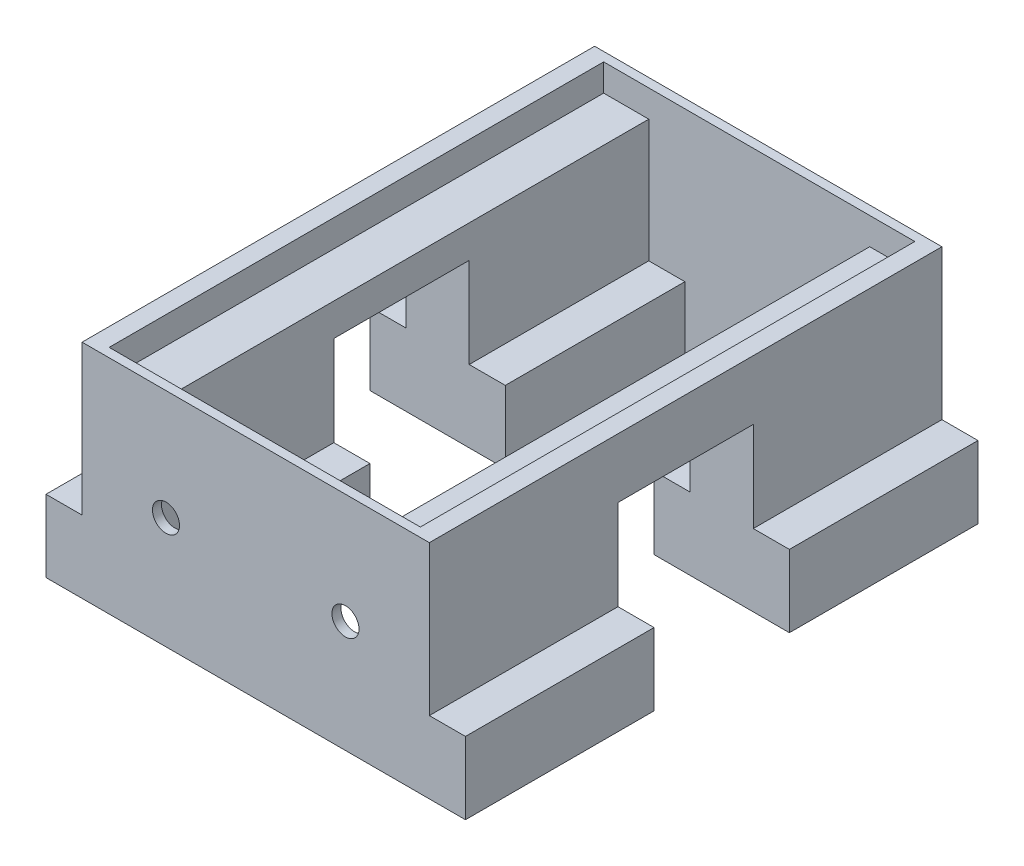
ISO-10303-21;
HEADER;
FILE_DESCRIPTION(('STEP AP214'),'2;1');
FILE_NAME('part.step','',(''),(''),'','','');
FILE_SCHEMA(('AUTOMOTIVE_DESIGN { 1 0 10303 214 1 1 1 1 }'));
ENDSEC;
DATA;
#1=APPLICATION_CONTEXT('core data for automotive mechanical design processes');
#2=APPLICATION_PROTOCOL_DEFINITION('international standard','automotive_design',2000,#1);
#3=PRODUCT_CONTEXT('',#1,'mechanical');
#4=PRODUCT('Part','Part','',(#3));
#5=PRODUCT_RELATED_PRODUCT_CATEGORY('part','',(#4));
#6=PRODUCT_DEFINITION_FORMATION('','',#4);
#7=PRODUCT_DEFINITION_CONTEXT('part definition',#1,'design');
#8=PRODUCT_DEFINITION('design','',#6,#7);
#9=PRODUCT_DEFINITION_SHAPE('','',#8);
#10=(LENGTH_UNIT() NAMED_UNIT(*) SI_UNIT(.MILLI.,.METRE.));
#11=(NAMED_UNIT(*) PLANE_ANGLE_UNIT() SI_UNIT($,.RADIAN.));
#12=(NAMED_UNIT(*) SI_UNIT($,.STERADIAN.) SOLID_ANGLE_UNIT());
#13=UNCERTAINTY_MEASURE_WITH_UNIT(LENGTH_MEASURE(1.E-05),#10,'distance_accuracy_value','');
#14=(GEOMETRIC_REPRESENTATION_CONTEXT(3) GLOBAL_UNCERTAINTY_ASSIGNED_CONTEXT((#13)) GLOBAL_UNIT_ASSIGNED_CONTEXT((#10,
#11,#12)) REPRESENTATION_CONTEXT('',''));
#15=CARTESIAN_POINT('',(0.,0.,0.));
#16=DIRECTION('',(0.,0.,1.));
#17=DIRECTION('',(1.,0.,0.));
#18=AXIS2_PLACEMENT_3D('',#15,#16,#17);
#19=CARTESIAN_POINT('',(116.225,40.,279.05));
#20=DIRECTION('',(-1.,0.,0.));
#21=DIRECTION('',(0.,0.,1.));
#22=AXIS2_PLACEMENT_3D('',#19,#20,#21);
#23=PLANE('',#22);
#24=DIRECTION('',(0.,1.,0.));
#25=VECTOR('',#24,1.);
#26=CARTESIAN_POINT('',(116.225,90.,99.525));
#27=LINE('',#26,#25);
#28=CARTESIAN_POINT('',(116.225,0.,99.525));
#29=VERTEX_POINT('',#28);
#30=CARTESIAN_POINT('',(116.225,40.,99.525));
#31=VERTEX_POINT('',#30);
#32=EDGE_CURVE('E276',#29,#31,#27,.T.);
#33=ORIENTED_EDGE('',*,*,#32,.F.);
#34=DIRECTION('',(0.,0.,-1.));
#35=VECTOR('',#34,1.);
#36=CARTESIAN_POINT('',(116.225,0.,279.05));
#37=LINE('',#36,#35);
#38=CARTESIAN_POINT('',(116.225,0.,-5.));
#39=VERTEX_POINT('',#38);
#40=EDGE_CURVE('E295',#29,#39,#37,.T.);
#41=ORIENTED_EDGE('',*,*,#40,.T.);
#42=DIRECTION('',(0.,-1.,0.));
#43=VECTOR('',#42,1.);
#44=CARTESIAN_POINT('',(116.225,0.,-5.));
#45=LINE('',#44,#43);
#46=CARTESIAN_POINT('',(116.225,40.,-5.));
#47=VERTEX_POINT('',#46);
#48=EDGE_CURVE('E527',#47,#39,#45,.T.);
#49=ORIENTED_EDGE('',*,*,#48,.F.);
#50=DIRECTION('',(0.,0.,-1.));
#51=VECTOR('',#50,1.);
#52=CARTESIAN_POINT('',(116.225,40.,279.05));
#53=LINE('',#52,#51);
#54=EDGE_CURVE('E294',#31,#47,#53,.T.);
#55=ORIENTED_EDGE('',*,*,#54,.F.);
#56=EDGE_LOOP('',(#33,#41,#49,#55));
#57=FACE_BOUND('',#56,.T.);
#58=ADVANCED_FACE('F42',(#57),#23,.F.);
#59=DIRECTION('',(0.,-1.,0.));
#60=VECTOR('',#59,1.);
#61=CARTESIAN_POINT('',(116.225,0.,174.525));
#62=LINE('',#61,#60);
#63=CARTESIAN_POINT('',(116.225,40.,174.525));
#64=VERTEX_POINT('',#63);
#65=CARTESIAN_POINT('',(116.225,0.,174.525));
#66=VERTEX_POINT('',#65);
#67=EDGE_CURVE('E287',#64,#66,#62,.T.);
#68=ORIENTED_EDGE('',*,*,#67,.F.);
#69=CARTESIAN_POINT('',(116.225,40.,279.05));
#70=VERTEX_POINT('',#69);
#71=EDGE_CURVE('E305',#70,#64,#53,.T.);
#72=ORIENTED_EDGE('',*,*,#71,.F.);
#73=DIRECTION('',(0.,1.,0.));
#74=VECTOR('',#73,1.);
#75=CARTESIAN_POINT('',(116.225,40.,279.05));
#76=LINE('',#75,#74);
#77=CARTESIAN_POINT('',(116.225,0.,279.05));
#78=VERTEX_POINT('',#77);
#79=EDGE_CURVE('E485',#78,#70,#76,.T.);
#80=ORIENTED_EDGE('',*,*,#79,.F.);
#81=EDGE_CURVE('E303',#78,#66,#37,.T.);
#82=ORIENTED_EDGE('',*,*,#81,.T.);
#83=EDGE_LOOP('',(#68,#72,#80,#82));
#84=FACE_BOUND('',#83,.T.);
#85=ADVANCED_FACE('F762',(#84),#23,.F.);
#86=CARTESIAN_POINT('',(-116.225,0.,274.05));
#87=DIRECTION('',(0.,1.,0.));
#88=DIRECTION('',(0.,0.,1.));
#89=AXIS2_PLACEMENT_3D('',#86,#87,#88);
#90=PLANE('',#89);
#91=DIRECTION('',(1.,0.,0.));
#92=VECTOR('',#91,1.);
#93=CARTESIAN_POINT('',(-183.775,0.,99.525));
#94=LINE('',#93,#92);
#95=CARTESIAN_POINT('',(-116.225,0.,99.525));
#96=VERTEX_POINT('',#95);
#97=CARTESIAN_POINT('',(-41.225,0.,99.525));
#98=VERTEX_POINT('',#97);
#99=EDGE_CURVE('E286',#96,#98,#94,.T.);
#100=ORIENTED_EDGE('',*,*,#99,.F.);
#101=DIRECTION('',(0.,0.,-1.));
#102=VECTOR('',#101,1.);
#103=CARTESIAN_POINT('',(-116.225,0.,274.05));
#104=LINE('',#103,#102);
#105=CARTESIAN_POINT('',(-116.225,0.,-5.));
#106=VERTEX_POINT('',#105);
#107=EDGE_CURVE('E339',#96,#106,#104,.T.);
#108=ORIENTED_EDGE('',*,*,#107,.T.);
#109=DIRECTION('',(-1.,0.,0.));
#110=VECTOR('',#109,1.);
#111=CARTESIAN_POINT('',(-116.225,0.,-5.));
#112=LINE('',#111,#110);
#113=EDGE_CURVE('E302',#39,#106,#112,.T.);
#114=ORIENTED_EDGE('',*,*,#113,.F.);
#115=ORIENTED_EDGE('',*,*,#40,.F.);
#116=CARTESIAN_POINT('',(41.225,0.,99.525));
#117=VERTEX_POINT('',#116);
#118=EDGE_CURVE('E277',#117,#29,#94,.T.);
#119=ORIENTED_EDGE('',*,*,#118,.F.);
#120=DIRECTION('',(0.,0.,-1.));
#121=VECTOR('',#120,1.);
#122=CARTESIAN_POINT('',(41.225,0.,274.05));
#123=LINE('',#122,#121);
#124=CARTESIAN_POINT('',(41.225,0.,0.));
#125=VERTEX_POINT('',#124);
#126=EDGE_CURVE('E425',#117,#125,#123,.T.);
#127=ORIENTED_EDGE('',*,*,#126,.T.);
#128=DIRECTION('',(-1.,0.,0.));
#129=VECTOR('',#128,1.);
#130=CARTESIAN_POINT('',(-116.225,0.,0.));
#131=LINE('',#130,#129);
#132=CARTESIAN_POINT('',(-41.225,0.,0.));
#133=VERTEX_POINT('',#132);
#134=EDGE_CURVE('E537',#125,#133,#131,.T.);
#135=ORIENTED_EDGE('',*,*,#134,.T.);
#136=DIRECTION('',(0.,0.,-1.));
#137=VECTOR('',#136,1.);
#138=CARTESIAN_POINT('',(-41.225,0.,274.05));
#139=LINE('',#138,#137);
#140=EDGE_CURVE('E393',#98,#133,#139,.T.);
#141=ORIENTED_EDGE('',*,*,#140,.F.);
#142=EDGE_LOOP('',(#100,#108,#114,#115,#119,#127,#135,#141));
#143=FACE_BOUND('',#142,.T.);
#144=ADVANCED_FACE('F297',(#143),#90,.F.);
#145=CARTESIAN_POINT('',(-41.225,0.,274.05));
#146=DIRECTION('',(-1.,0.,0.));
#147=DIRECTION('',(0.,-1.,0.));
#148=AXIS2_PLACEMENT_3D('',#145,#146,#147);
#149=PLANE('',#148);
#150=CARTESIAN_POINT('',(-41.225,0.,274.05));
#151=VERTEX_POINT('',#150);
#152=CARTESIAN_POINT('',(-41.225,0.,174.525));
#153=VERTEX_POINT('',#152);
#154=EDGE_CURVE('E392',#151,#153,#139,.T.);
#155=ORIENTED_EDGE('',*,*,#154,.T.);
#156=DIRECTION('',(0.,1.,0.));
#157=VECTOR('',#156,1.);
#158=CARTESIAN_POINT('',(-41.225,0.,174.525));
#159=LINE('',#158,#157);
#160=CARTESIAN_POINT('',(-41.225,40.,174.525));
#161=VERTEX_POINT('',#160);
#162=EDGE_CURVE('E687',#153,#161,#159,.T.);
#163=ORIENTED_EDGE('',*,*,#162,.T.);
#164=DIRECTION('',(0.,0.,-1.));
#165=VECTOR('',#164,1.);
#166=CARTESIAN_POINT('',(-41.225,40.,274.05));
#167=LINE('',#166,#165);
#168=CARTESIAN_POINT('',(-41.225,40.,274.05));
#169=VERTEX_POINT('',#168);
#170=EDGE_CURVE('E388',#169,#161,#167,.T.);
#171=ORIENTED_EDGE('',*,*,#170,.F.);
#172=DIRECTION('',(0.,1.,0.));
#173=VECTOR('',#172,1.);
#174=CARTESIAN_POINT('',(-41.225,0.,274.05));
#175=LINE('',#174,#173);
#176=EDGE_CURVE('E312',#151,#169,#175,.T.);
#177=ORIENTED_EDGE('',*,*,#176,.F.);
#178=EDGE_LOOP('',(#155,#163,#171,#177));
#179=FACE_BOUND('',#178,.T.);
#180=ADVANCED_FACE('F796',(#179),#149,.F.);
#181=CARTESIAN_POINT('',(-41.225,40.,274.05));
#182=DIRECTION('',(0.,-1.,0.));
#183=DIRECTION('',(0.,0.,-1.));
#184=AXIS2_PLACEMENT_3D('',#181,#182,#183);
#185=PLANE('',#184);
#186=ORIENTED_EDGE('',*,*,#170,.T.);
#187=DIRECTION('',(-1.,0.,0.));
#188=VECTOR('',#187,1.);
#189=CARTESIAN_POINT('',(-41.225,40.,174.525));
#190=LINE('',#189,#188);
#191=CARTESIAN_POINT('',(-61.225,40.,174.525));
#192=VERTEX_POINT('',#191);
#193=EDGE_CURVE('E685',#161,#192,#190,.T.);
#194=ORIENTED_EDGE('',*,*,#193,.T.);
#195=DIRECTION('',(0.,0.,-1.));
#196=VECTOR('',#195,1.);
#197=CARTESIAN_POINT('',(-61.225,40.,274.05));
#198=LINE('',#197,#196);
#199=CARTESIAN_POINT('',(-61.225,40.,274.05));
#200=VERTEX_POINT('',#199);
#201=EDGE_CURVE('E384',#200,#192,#198,.T.);
#202=ORIENTED_EDGE('',*,*,#201,.F.);
#203=DIRECTION('',(-1.,0.,0.));
#204=VECTOR('',#203,1.);
#205=CARTESIAN_POINT('',(-41.225,40.,274.05));
#206=LINE('',#205,#204);
#207=EDGE_CURVE('E317',#169,#200,#206,.T.);
#208=ORIENTED_EDGE('',*,*,#207,.F.);
#209=EDGE_LOOP('',(#186,#194,#202,#208));
#210=FACE_BOUND('',#209,.T.);
#211=ADVANCED_FACE('F795',(#210),#185,.F.);
#212=CARTESIAN_POINT('',(-96.225,40.,274.05));
#213=DIRECTION('',(0.,-1.,0.));
#214=DIRECTION('',(1.,0.,0.));
#215=AXIS2_PLACEMENT_3D('',#212,#213,#214);
#216=PLANE('',#215);
#217=DIRECTION('',(0.,0.,-1.));
#218=VECTOR('',#217,1.);
#219=CARTESIAN_POINT('',(-96.225,40.,274.05));
#220=LINE('',#219,#218);
#221=CARTESIAN_POINT('',(-96.225,40.,279.05));
#222=VERTEX_POINT('',#221);
#223=CARTESIAN_POINT('',(-96.225,40.,174.525));
#224=VERTEX_POINT('',#223);
#225=EDGE_CURVE('E364',#222,#224,#220,.T.);
#226=ORIENTED_EDGE('',*,*,#225,.T.);
#227=DIRECTION('',(-1.,0.,0.));
#228=VECTOR('',#227,1.);
#229=CARTESIAN_POINT('',(-96.225,40.,174.525));
#230=LINE('',#229,#228);
#231=CARTESIAN_POINT('',(-116.225,40.,174.525));
#232=VERTEX_POINT('',#231);
#233=EDGE_CURVE('E669',#224,#232,#230,.T.);
#234=ORIENTED_EDGE('',*,*,#233,.T.);
#235=DIRECTION('',(0.,0.,-1.));
#236=VECTOR('',#235,1.);
#237=CARTESIAN_POINT('',(-116.225,40.,274.05));
#238=LINE('',#237,#236);
#239=CARTESIAN_POINT('',(-116.225,40.,279.05));
#240=VERTEX_POINT('',#239);
#241=EDGE_CURVE('E360',#240,#232,#238,.T.);
#242=ORIENTED_EDGE('',*,*,#241,.F.);
#243=DIRECTION('',(-1.,0.,0.));
#244=VECTOR('',#243,1.);
#245=CARTESIAN_POINT('',(-116.225,40.,279.05));
#246=LINE('',#245,#244);
#247=EDGE_CURVE('E470',#222,#240,#246,.T.);
#248=ORIENTED_EDGE('',*,*,#247,.F.);
#249=EDGE_LOOP('',(#226,#234,#242,#248));
#250=FACE_BOUND('',#249,.T.);
#251=ADVANCED_FACE('F778',(#250),#216,.F.);
#252=CARTESIAN_POINT('',(-116.225,40.,274.05));
#253=DIRECTION('',(1.,0.,0.));
#254=DIRECTION('',(0.,0.,-1.));
#255=AXIS2_PLACEMENT_3D('',#252,#253,#254);
#256=PLANE('',#255);
#257=ORIENTED_EDGE('',*,*,#241,.T.);
#258=DIRECTION('',(0.,-1.,0.));
#259=VECTOR('',#258,1.);
#260=CARTESIAN_POINT('',(-116.225,40.,174.525));
#261=LINE('',#260,#259);
#262=CARTESIAN_POINT('',(-116.225,0.,174.525));
#263=VERTEX_POINT('',#262);
#264=EDGE_CURVE('E659',#232,#263,#261,.T.);
#265=ORIENTED_EDGE('',*,*,#264,.T.);
#266=CARTESIAN_POINT('',(-116.225,0.,279.05));
#267=VERTEX_POINT('',#266);
#268=EDGE_CURVE('E352',#267,#263,#104,.T.);
#269=ORIENTED_EDGE('',*,*,#268,.F.);
#270=DIRECTION('',(0.,-1.,0.));
#271=VECTOR('',#270,1.);
#272=CARTESIAN_POINT('',(-116.225,0.,279.05));
#273=LINE('',#272,#271);
#274=EDGE_CURVE('E474',#240,#267,#273,.T.);
#275=ORIENTED_EDGE('',*,*,#274,.F.);
#276=EDGE_LOOP('',(#257,#265,#269,#275));
#277=FACE_BOUND('',#276,.T.);
#278=ADVANCED_FACE('F779',(#277),#256,.F.);
#279=CARTESIAN_POINT('',(96.225,40.,279.05));
#280=DIRECTION('',(0.,-1.,0.));
#281=DIRECTION('',(1.,0.,0.));
#282=AXIS2_PLACEMENT_3D('',#279,#280,#281);
#283=PLANE('',#282);
#284=ORIENTED_EDGE('',*,*,#71,.T.);
#285=DIRECTION('',(-1.,0.,0.));
#286=VECTOR('',#285,1.);
#287=CARTESIAN_POINT('',(96.225,40.,174.525));
#288=LINE('',#287,#286);
#289=CARTESIAN_POINT('',(96.225,40.,174.525));
#290=VERTEX_POINT('',#289);
#291=EDGE_CURVE('E660',#64,#290,#288,.T.);
#292=ORIENTED_EDGE('',*,*,#291,.T.);
#293=DIRECTION('',(0.,0.,-1.));
#294=VECTOR('',#293,1.);
#295=CARTESIAN_POINT('',(96.225,40.,279.05));
#296=LINE('',#295,#294);
#297=CARTESIAN_POINT('',(96.225,40.,279.05));
#298=VERTEX_POINT('',#297);
#299=EDGE_CURVE('E501',#298,#290,#296,.T.);
#300=ORIENTED_EDGE('',*,*,#299,.F.);
#301=DIRECTION('',(-1.,0.,0.));
#302=VECTOR('',#301,1.);
#303=CARTESIAN_POINT('',(96.225,40.,279.05));
#304=LINE('',#303,#302);
#305=EDGE_CURVE('E484',#70,#298,#304,.T.);
#306=ORIENTED_EDGE('',*,*,#305,.F.);
#307=EDGE_LOOP('',(#284,#292,#300,#306));
#308=FACE_BOUND('',#307,.T.);
#309=ADVANCED_FACE('F656',(#308),#283,.F.);
#310=CARTESIAN_POINT('',(41.225,40.,274.05));
#311=DIRECTION('',(0.,-1.,0.));
#312=DIRECTION('',(0.,0.,-1.));
#313=AXIS2_PLACEMENT_3D('',#310,#311,#312);
#314=PLANE('',#313);
#315=DIRECTION('',(0.,0.,-1.));
#316=VECTOR('',#315,1.);
#317=CARTESIAN_POINT('',(61.225,40.,274.05));
#318=LINE('',#317,#316);
#319=CARTESIAN_POINT('',(61.225,40.,274.05));
#320=VERTEX_POINT('',#319);
#321=CARTESIAN_POINT('',(61.225,40.,174.525));
#322=VERTEX_POINT('',#321);
#323=EDGE_CURVE('E577',#320,#322,#318,.T.);
#324=ORIENTED_EDGE('',*,*,#323,.T.);
#325=DIRECTION('',(-1.,0.,0.));
#326=VECTOR('',#325,1.);
#327=CARTESIAN_POINT('',(41.225,40.,174.525));
#328=LINE('',#327,#326);
#329=CARTESIAN_POINT('',(41.225,40.,174.525));
#330=VERTEX_POINT('',#329);
#331=EDGE_CURVE('E748',#322,#330,#328,.T.);
#332=ORIENTED_EDGE('',*,*,#331,.T.);
#333=DIRECTION('',(0.,0.,-1.));
#334=VECTOR('',#333,1.);
#335=CARTESIAN_POINT('',(41.225,40.,274.05));
#336=LINE('',#335,#334);
#337=CARTESIAN_POINT('',(41.225,40.,274.05));
#338=VERTEX_POINT('',#337);
#339=EDGE_CURVE('E408',#338,#330,#336,.T.);
#340=ORIENTED_EDGE('',*,*,#339,.F.);
#341=DIRECTION('',(-1.,0.,0.));
#342=VECTOR('',#341,1.);
#343=CARTESIAN_POINT('',(41.225,40.,274.05));
#344=LINE('',#343,#342);
#345=EDGE_CURVE('E426',#320,#338,#344,.T.);
#346=ORIENTED_EDGE('',*,*,#345,.F.);
#347=EDGE_LOOP('',(#324,#332,#340,#346));
#348=FACE_BOUND('',#347,.T.);
#349=ADVANCED_FACE('F811',(#348),#314,.F.);
#350=CARTESIAN_POINT('',(41.225,0.,274.05));
#351=DIRECTION('',(1.,0.,0.));
#352=DIRECTION('',(0.,1.,0.));
#353=AXIS2_PLACEMENT_3D('',#350,#351,#352);
#354=PLANE('',#353);
#355=ORIENTED_EDGE('',*,*,#339,.T.);
#356=DIRECTION('',(0.,-1.,0.));
#357=VECTOR('',#356,1.);
#358=CARTESIAN_POINT('',(41.225,0.,174.525));
#359=LINE('',#358,#357);
#360=CARTESIAN_POINT('',(41.225,0.,174.525));
#361=VERTEX_POINT('',#360);
#362=EDGE_CURVE('E52',#330,#361,#359,.T.);
#363=ORIENTED_EDGE('',*,*,#362,.T.);
#364=CARTESIAN_POINT('',(41.225,0.,274.05));
#365=VERTEX_POINT('',#364);
#366=EDGE_CURVE('E409',#365,#361,#123,.T.);
#367=ORIENTED_EDGE('',*,*,#366,.F.);
#368=DIRECTION('',(0.,-1.,0.));
#369=VECTOR('',#368,1.);
#370=CARTESIAN_POINT('',(41.225,0.,274.05));
#371=LINE('',#370,#369);
#372=EDGE_CURVE('E423',#338,#365,#371,.T.);
#373=ORIENTED_EDGE('',*,*,#372,.F.);
#374=EDGE_LOOP('',(#355,#363,#367,#373));
#375=FACE_BOUND('',#374,.T.);
#376=ADVANCED_FACE('F403',(#375),#354,.F.);
#377=CARTESIAN_POINT('',(0.,0.,274.05));
#378=DIRECTION('',(0.,0.,-1.));
#379=DIRECTION('',(-1.,0.,0.));
#380=AXIS2_PLACEMENT_3D('',#377,#378,#379);
#381=PLANE('',#380);
#382=CARTESIAN_POINT('',(-49.725,61.9999999999999,274.05));
#383=DIRECTION('',(0.,0.,-1.));
#384=DIRECTION('',(-1.,0.,0.));
#385=AXIS2_PLACEMENT_3D('',#382,#383,#384);
#386=CIRCLE('',#385,7.5);
#387=CARTESIAN_POINT('',(-57.225,61.9999999999999,274.05));
#388=VERTEX_POINT('',#387);
#389=EDGE_CURVE('E299',#388,#388,#386,.T.);
#390=ORIENTED_EDGE('',*,*,#389,.F.);
#391=EDGE_LOOP('',(#390));
#392=FACE_BOUND('',#391,.T.);
#393=CARTESIAN_POINT('',(49.725,61.9999999999999,274.05));
#394=DIRECTION('',(0.,0.,-1.));
#395=DIRECTION('',(-1.,0.,0.));
#396=AXIS2_PLACEMENT_3D('',#393,#394,#395);
#397=CIRCLE('',#396,7.5);
#398=CARTESIAN_POINT('',(42.225,61.9999999999999,274.05));
#399=VERTEX_POINT('',#398);
#400=EDGE_CURVE('E922',#399,#399,#397,.T.);
#401=ORIENTED_EDGE('',*,*,#400,.F.);
#402=EDGE_LOOP('',(#401));
#403=FACE_BOUND('',#402,.T.);
#404=DIRECTION('',(-1.,0.,0.));
#405=VECTOR('',#404,1.);
#406=CARTESIAN_POINT('',(-96.225,123.,274.05));
#407=LINE('',#406,#405);
#408=CARTESIAN_POINT('',(86.225,123.,274.05));
#409=VERTEX_POINT('',#408);
#410=CARTESIAN_POINT('',(-86.225,123.,274.05));
#411=VERTEX_POINT('',#410);
#412=EDGE_CURVE('E473',#409,#411,#407,.T.);
#413=ORIENTED_EDGE('',*,*,#412,.F.);
#414=DIRECTION('',(0.,-1.,0.));
#415=VECTOR('',#414,1.);
#416=CARTESIAN_POINT('',(86.225,108.,274.05));
#417=LINE('',#416,#415);
#418=CARTESIAN_POINT('',(86.225,108.,274.05));
#419=VERTEX_POINT('',#418);
#420=EDGE_CURVE('E436',#409,#419,#417,.T.);
#421=ORIENTED_EDGE('',*,*,#420,.T.);
#422=DIRECTION('',(-1.,0.,0.));
#423=VECTOR('',#422,1.);
#424=CARTESIAN_POINT('',(61.225,108.,274.05));
#425=LINE('',#424,#423);
#426=CARTESIAN_POINT('',(61.225,108.,274.05));
#427=VERTEX_POINT('',#426);
#428=EDGE_CURVE('E459',#419,#427,#425,.T.);
#429=ORIENTED_EDGE('',*,*,#428,.T.);
#430=DIRECTION('',(0.,-1.,0.));
#431=VECTOR('',#430,1.);
#432=CARTESIAN_POINT('',(61.225,40.,274.05));
#433=LINE('',#432,#431);
#434=EDGE_CURVE('E455',#427,#320,#433,.T.);
#435=ORIENTED_EDGE('',*,*,#434,.T.);
#436=ORIENTED_EDGE('',*,*,#345,.T.);
#437=ORIENTED_EDGE('',*,*,#372,.T.);
#438=DIRECTION('',(1.,0.,0.));
#439=VECTOR('',#438,1.);
#440=CARTESIAN_POINT('',(116.225,0.,274.05));
#441=LINE('',#440,#439);
#442=EDGE_CURVE('E420',#151,#365,#441,.T.);
#443=ORIENTED_EDGE('',*,*,#442,.F.);
#444=ORIENTED_EDGE('',*,*,#176,.T.);
#445=ORIENTED_EDGE('',*,*,#207,.T.);
#446=DIRECTION('',(0.,1.,0.));
#447=VECTOR('',#446,1.);
#448=CARTESIAN_POINT('',(-61.225,40.,274.05));
#449=LINE('',#448,#447);
#450=CARTESIAN_POINT('',(-61.225,108.,274.05));
#451=VERTEX_POINT('',#450);
#452=EDGE_CURVE('E322',#200,#451,#449,.T.);
#453=ORIENTED_EDGE('',*,*,#452,.T.);
#454=DIRECTION('',(-1.,0.,0.));
#455=VECTOR('',#454,1.);
#456=CARTESIAN_POINT('',(-61.225,108.,274.05));
#457=LINE('',#456,#455);
#458=CARTESIAN_POINT('',(-86.225,108.,274.05));
#459=VERTEX_POINT('',#458);
#460=EDGE_CURVE('E327',#451,#459,#457,.T.);
#461=ORIENTED_EDGE('',*,*,#460,.T.);
#462=DIRECTION('',(0.,1.,0.));
#463=VECTOR('',#462,1.);
#464=CARTESIAN_POINT('',(-86.225,108.,274.05));
#465=LINE('',#464,#463);
#466=EDGE_CURVE('E335',#459,#411,#465,.T.);
#467=ORIENTED_EDGE('',*,*,#466,.T.);
#468=EDGE_LOOP('',(#413,#421,#429,#435,#436,#437,#443,#444,#445,#453,#461,#467));
#469=FACE_BOUND('',#468,.T.);
#470=ADVANCED_FACE('F800',(#392,#403,#469),#381,.T.);
#471=ORIENTED_EDGE('',*,*,#268,.T.);
#472=DIRECTION('',(1.,0.,0.));
#473=VECTOR('',#472,1.);
#474=CARTESIAN_POINT('',(-183.775,0.,174.525));
#475=LINE('',#474,#473);
#476=EDGE_CURVE('E711',#263,#153,#475,.T.);
#477=ORIENTED_EDGE('',*,*,#476,.T.);
#478=ORIENTED_EDGE('',*,*,#154,.F.);
#479=ORIENTED_EDGE('',*,*,#442,.T.);
#480=ORIENTED_EDGE('',*,*,#366,.T.);
#481=EDGE_CURVE('E418',#361,#66,#475,.T.);
#482=ORIENTED_EDGE('',*,*,#481,.T.);
#483=ORIENTED_EDGE('',*,*,#81,.F.);
#484=DIRECTION('',(1.,0.,0.));
#485=VECTOR('',#484,1.);
#486=CARTESIAN_POINT('',(116.225,0.,279.05));
#487=LINE('',#486,#485);
#488=EDGE_CURVE('E479',#267,#78,#487,.T.);
#489=ORIENTED_EDGE('',*,*,#488,.F.);
#490=EDGE_LOOP('',(#471,#477,#478,#479,#480,#482,#483,#489));
#491=FACE_BOUND('',#490,.T.);
#492=ADVANCED_FACE('F46',(#491),#90,.F.);
#493=CARTESIAN_POINT('',(-41.225,40.,99.525));
#494=VERTEX_POINT('',#493);
#495=CARTESIAN_POINT('',(-41.225,40.,0.));
#496=VERTEX_POINT('',#495);
#497=EDGE_CURVE('E386',#494,#496,#167,.T.);
#498=ORIENTED_EDGE('',*,*,#497,.F.);
#499=DIRECTION('',(0.,-1.,0.));
#500=VECTOR('',#499,1.);
#501=CARTESIAN_POINT('',(-41.225,0.,99.525));
#502=LINE('',#501,#500);
#503=EDGE_CURVE('E742',#494,#98,#502,.T.);
#504=ORIENTED_EDGE('',*,*,#503,.T.);
#505=ORIENTED_EDGE('',*,*,#140,.T.);
#506=DIRECTION('',(0.,1.,0.));
#507=VECTOR('',#506,1.);
#508=CARTESIAN_POINT('',(-41.225,0.,0.));
#509=LINE('',#508,#507);
#510=EDGE_CURVE('E309',#133,#496,#509,.T.);
#511=ORIENTED_EDGE('',*,*,#510,.T.);
#512=EDGE_LOOP('',(#498,#504,#505,#511));
#513=FACE_BOUND('',#512,.T.);
#514=ADVANCED_FACE('F791',(#513),#149,.F.);
#515=CARTESIAN_POINT('',(-61.225,40.,99.525));
#516=VERTEX_POINT('',#515);
#517=CARTESIAN_POINT('',(-61.225,40.,0.));
#518=VERTEX_POINT('',#517);
#519=EDGE_CURVE('E383',#516,#518,#198,.T.);
#520=ORIENTED_EDGE('',*,*,#519,.F.);
#521=DIRECTION('',(1.,0.,0.));
#522=VECTOR('',#521,1.);
#523=CARTESIAN_POINT('',(-41.225,40.,99.525));
#524=LINE('',#523,#522);
#525=EDGE_CURVE('E738',#516,#494,#524,.T.);
#526=ORIENTED_EDGE('',*,*,#525,.T.);
#527=ORIENTED_EDGE('',*,*,#497,.T.);
#528=DIRECTION('',(-1.,0.,0.));
#529=VECTOR('',#528,1.);
#530=CARTESIAN_POINT('',(-41.225,40.,0.));
#531=LINE('',#530,#529);
#532=EDGE_CURVE('E337',#496,#518,#531,.T.);
#533=ORIENTED_EDGE('',*,*,#532,.T.);
#534=EDGE_LOOP('',(#520,#526,#527,#533));
#535=FACE_BOUND('',#534,.T.);
#536=ADVANCED_FACE('F788',(#535),#185,.F.);
#537=CARTESIAN_POINT('',(-61.225,40.,274.05));
#538=DIRECTION('',(-1.,0.,0.));
#539=DIRECTION('',(0.,-1.,0.));
#540=AXIS2_PLACEMENT_3D('',#537,#538,#539);
#541=PLANE('',#540);
#542=ORIENTED_EDGE('',*,*,#201,.T.);
#543=DIRECTION('',(0.,1.,0.));
#544=VECTOR('',#543,1.);
#545=CARTESIAN_POINT('',(-61.225,40.,174.525));
#546=LINE('',#545,#544);
#547=CARTESIAN_POINT('',(-61.225,90.,174.525));
#548=VERTEX_POINT('',#547);
#549=EDGE_CURVE('E679',#192,#548,#546,.T.);
#550=ORIENTED_EDGE('',*,*,#549,.T.);
#551=DIRECTION('',(0.,0.,-1.));
#552=VECTOR('',#551,1.);
#553=CARTESIAN_POINT('',(-61.225,90.,274.05));
#554=LINE('',#553,#552);
#555=CARTESIAN_POINT('',(-61.225,90.,99.525));
#556=VERTEX_POINT('',#555);
#557=EDGE_CURVE('E545',#548,#556,#554,.T.);
#558=ORIENTED_EDGE('',*,*,#557,.T.);
#559=DIRECTION('',(0.,-1.,0.));
#560=VECTOR('',#559,1.);
#561=CARTESIAN_POINT('',(-61.225,40.0000000000001,99.525));
#562=LINE('',#561,#560);
#563=EDGE_CURVE('E625',#556,#516,#562,.T.);
#564=ORIENTED_EDGE('',*,*,#563,.T.);
#565=ORIENTED_EDGE('',*,*,#519,.T.);
#566=DIRECTION('',(0.,1.,0.));
#567=VECTOR('',#566,1.);
#568=CARTESIAN_POINT('',(-61.225,40.,0.));
#569=LINE('',#568,#567);
#570=CARTESIAN_POINT('',(-61.225,108.,0.));
#571=VERTEX_POINT('',#570);
#572=EDGE_CURVE('E343',#518,#571,#569,.T.);
#573=ORIENTED_EDGE('',*,*,#572,.T.);
#574=DIRECTION('',(0.,0.,-1.));
#575=VECTOR('',#574,1.);
#576=CARTESIAN_POINT('',(-61.225,108.,274.05));
#577=LINE('',#576,#575);
#578=EDGE_CURVE('E379',#451,#571,#577,.T.);
#579=ORIENTED_EDGE('',*,*,#578,.F.);
#580=ORIENTED_EDGE('',*,*,#452,.F.);
#581=EDGE_LOOP('',(#542,#550,#558,#564,#565,#573,#579,#580));
#582=FACE_BOUND('',#581,.T.);
#583=ADVANCED_FACE('F617',(#582),#541,.F.);
#584=CARTESIAN_POINT('',(-61.225,108.,274.05));
#585=DIRECTION('',(0.,-1.,0.));
#586=DIRECTION('',(0.,0.,-1.));
#587=AXIS2_PLACEMENT_3D('',#584,#585,#586);
#588=PLANE('',#587);
#589=DIRECTION('',(-1.,0.,0.));
#590=VECTOR('',#589,1.);
#591=CARTESIAN_POINT('',(-61.225,108.,0.));
#592=LINE('',#591,#590);
#593=CARTESIAN_POINT('',(-86.225,108.,0.));
#594=VERTEX_POINT('',#593);
#595=EDGE_CURVE('E346',#571,#594,#592,.T.);
#596=ORIENTED_EDGE('',*,*,#595,.T.);
#597=DIRECTION('',(0.,0.,-1.));
#598=VECTOR('',#597,1.);
#599=CARTESIAN_POINT('',(-86.225,108.,274.05));
#600=LINE('',#599,#598);
#601=EDGE_CURVE('E376',#459,#594,#600,.T.);
#602=ORIENTED_EDGE('',*,*,#601,.F.);
#603=ORIENTED_EDGE('',*,*,#460,.F.);
#604=ORIENTED_EDGE('',*,*,#578,.T.);
#605=EDGE_LOOP('',(#596,#602,#603,#604));
#606=FACE_BOUND('',#605,.T.);
#607=ADVANCED_FACE('F615',(#606),#588,.F.);
#608=CARTESIAN_POINT('',(-86.225,108.,274.05));
#609=DIRECTION('',(-1.,0.,0.));
#610=DIRECTION('',(0.,0.,1.));
#611=AXIS2_PLACEMENT_3D('',#608,#609,#610);
#612=PLANE('',#611);
#613=DIRECTION('',(0.,1.,0.));
#614=VECTOR('',#613,1.);
#615=CARTESIAN_POINT('',(-86.225,108.,0.));
#616=LINE('',#615,#614);
#617=CARTESIAN_POINT('',(-86.225,123.,0.));
#618=VERTEX_POINT('',#617);
#619=EDGE_CURVE('E319',#594,#618,#616,.T.);
#620=ORIENTED_EDGE('',*,*,#619,.T.);
#621=DIRECTION('',(0.,0.,-1.));
#622=VECTOR('',#621,1.);
#623=CARTESIAN_POINT('',(-86.225,123.,274.05));
#624=LINE('',#623,#622);
#625=EDGE_CURVE('E375',#411,#618,#624,.T.);
#626=ORIENTED_EDGE('',*,*,#625,.F.);
#627=ORIENTED_EDGE('',*,*,#466,.F.);
#628=ORIENTED_EDGE('',*,*,#601,.T.);
#629=EDGE_LOOP('',(#620,#626,#627,#628));
#630=FACE_BOUND('',#629,.T.);
#631=ADVANCED_FACE('F606',(#630),#612,.F.);
#632=CARTESIAN_POINT('',(-86.225,123.,274.05));
#633=DIRECTION('',(0.,-1.,0.));
#634=DIRECTION('',(0.,0.,-1.));
#635=AXIS2_PLACEMENT_3D('',#632,#633,#634);
#636=PLANE('',#635);
#637=DIRECTION('',(1.,0.,0.));
#638=VECTOR('',#637,1.);
#639=CARTESIAN_POINT('',(96.225,123.,-5.));
#640=LINE('',#639,#638);
#641=CARTESIAN_POINT('',(-96.225,123.,-5.));
#642=VERTEX_POINT('',#641);
#643=CARTESIAN_POINT('',(96.225,123.,-5.));
#644=VERTEX_POINT('',#643);
#645=EDGE_CURVE('E531',#642,#644,#640,.T.);
#646=ORIENTED_EDGE('',*,*,#645,.F.);
#647=DIRECTION('',(0.,0.,-1.));
#648=VECTOR('',#647,1.);
#649=CARTESIAN_POINT('',(-96.225,123.,274.05));
#650=LINE('',#649,#648);
#651=CARTESIAN_POINT('',(-96.225,123.,279.05));
#652=VERTEX_POINT('',#651);
#653=EDGE_CURVE('E369',#652,#642,#650,.T.);
#654=ORIENTED_EDGE('',*,*,#653,.F.);
#655=DIRECTION('',(-1.,0.,0.));
#656=VECTOR('',#655,1.);
#657=CARTESIAN_POINT('',(-96.225,123.,279.05));
#658=LINE('',#657,#656);
#659=CARTESIAN_POINT('',(96.225,123.,279.05));
#660=VERTEX_POINT('',#659);
#661=EDGE_CURVE('E491',#660,#652,#658,.T.);
#662=ORIENTED_EDGE('',*,*,#661,.F.);
#663=DIRECTION('',(0.,0.,-1.));
#664=VECTOR('',#663,1.);
#665=CARTESIAN_POINT('',(96.225,123.,279.05));
#666=LINE('',#665,#664);
#667=EDGE_CURVE('E494',#660,#644,#666,.T.);
#668=ORIENTED_EDGE('',*,*,#667,.T.);
#669=EDGE_LOOP('',(#646,#654,#662,#668));
#670=FACE_BOUND('',#669,.T.);
#671=ORIENTED_EDGE('',*,*,#625,.T.);
#672=DIRECTION('',(1.,0.,0.));
#673=VECTOR('',#672,1.);
#674=CARTESIAN_POINT('',(96.225,123.,0.));
#675=LINE('',#674,#673);
#676=CARTESIAN_POINT('',(86.225,123.,0.));
#677=VERTEX_POINT('',#676);
#678=EDGE_CURVE('E532',#618,#677,#675,.T.);
#679=ORIENTED_EDGE('',*,*,#678,.T.);
#680=DIRECTION('',(0.,0.,-1.));
#681=VECTOR('',#680,1.);
#682=CARTESIAN_POINT('',(86.225,123.,274.05));
#683=LINE('',#682,#681);
#684=EDGE_CURVE('E562',#409,#677,#683,.T.);
#685=ORIENTED_EDGE('',*,*,#684,.F.);
#686=ORIENTED_EDGE('',*,*,#412,.T.);
#687=EDGE_LOOP('',(#671,#679,#685,#686));
#688=FACE_BOUND('',#687,.T.);
#689=ADVANCED_FACE('F607',(#670,#688),#636,.F.);
#690=CARTESIAN_POINT('',(-96.225,123.,274.05));
#691=DIRECTION('',(1.,0.,0.));
#692=DIRECTION('',(0.,1.,0.));
#693=AXIS2_PLACEMENT_3D('',#690,#691,#692);
#694=PLANE('',#693);
#695=DIRECTION('',(0.,0.,1.));
#696=VECTOR('',#695,1.);
#697=CARTESIAN_POINT('',(-96.225,90.,274.05));
#698=LINE('',#697,#696);
#699=CARTESIAN_POINT('',(-96.225,90.,99.525));
#700=VERTEX_POINT('',#699);
#701=CARTESIAN_POINT('',(-96.225,90.,174.525));
#702=VERTEX_POINT('',#701);
#703=EDGE_CURVE('E691',#700,#702,#698,.T.);
#704=ORIENTED_EDGE('',*,*,#703,.T.);
#705=DIRECTION('',(0.,-1.,0.));
#706=VECTOR('',#705,1.);
#707=CARTESIAN_POINT('',(-96.225,123.,174.525));
#708=LINE('',#707,#706);
#709=EDGE_CURVE('E675',#702,#224,#708,.T.);
#710=ORIENTED_EDGE('',*,*,#709,.T.);
#711=ORIENTED_EDGE('',*,*,#225,.F.);
#712=DIRECTION('',(0.,-1.,0.));
#713=VECTOR('',#712,1.);
#714=CARTESIAN_POINT('',(-96.225,40.,279.05));
#715=LINE('',#714,#713);
#716=EDGE_CURVE('E466',#652,#222,#715,.T.);
#717=ORIENTED_EDGE('',*,*,#716,.F.);
#718=ORIENTED_EDGE('',*,*,#653,.T.);
#719=DIRECTION('',(0.,1.,0.));
#720=VECTOR('',#719,1.);
#721=CARTESIAN_POINT('',(-96.225,123.,-5.));
#722=LINE('',#721,#720);
#723=CARTESIAN_POINT('',(-96.225,40.,-5.));
#724=VERTEX_POINT('',#723);
#725=EDGE_CURVE('E556',#724,#642,#722,.T.);
#726=ORIENTED_EDGE('',*,*,#725,.F.);
#727=CARTESIAN_POINT('',(-96.225,40.,99.525));
#728=VERTEX_POINT('',#727);
#729=EDGE_CURVE('E365',#728,#724,#220,.T.);
#730=ORIENTED_EDGE('',*,*,#729,.F.);
#731=DIRECTION('',(0.,1.,0.));
#732=VECTOR('',#731,1.);
#733=CARTESIAN_POINT('',(-96.225,123.,99.5250000000001));
#734=LINE('',#733,#732);
#735=EDGE_CURVE('E734',#728,#700,#734,.T.);
#736=ORIENTED_EDGE('',*,*,#735,.T.);
#737=EDGE_LOOP('',(#704,#710,#711,#717,#718,#726,#730,#736));
#738=FACE_BOUND('',#737,.T.);
#739=ADVANCED_FACE('F644',(#738),#694,.F.);
#740=CARTESIAN_POINT('',(-116.225,40.,99.525));
#741=VERTEX_POINT('',#740);
#742=CARTESIAN_POINT('',(-116.225,40.,-5.));
#743=VERTEX_POINT('',#742);
#744=EDGE_CURVE('E358',#741,#743,#238,.T.);
#745=ORIENTED_EDGE('',*,*,#744,.F.);
#746=DIRECTION('',(1.,0.,0.));
#747=VECTOR('',#746,1.);
#748=CARTESIAN_POINT('',(-96.225,40.,99.525));
#749=LINE('',#748,#747);
#750=EDGE_CURVE('E58',#741,#728,#749,.T.);
#751=ORIENTED_EDGE('',*,*,#750,.T.);
#752=ORIENTED_EDGE('',*,*,#729,.T.);
#753=DIRECTION('',(1.,0.,0.));
#754=VECTOR('',#753,1.);
#755=CARTESIAN_POINT('',(-96.225,40.,-5.));
#756=LINE('',#755,#754);
#757=EDGE_CURVE('E554',#743,#724,#756,.T.);
#758=ORIENTED_EDGE('',*,*,#757,.F.);
#759=EDGE_LOOP('',(#745,#751,#752,#758));
#760=FACE_BOUND('',#759,.T.);
#761=ADVANCED_FACE('F640',(#760),#216,.F.);
#762=ORIENTED_EDGE('',*,*,#107,.F.);
#763=DIRECTION('',(0.,1.,0.));
#764=VECTOR('',#763,1.);
#765=CARTESIAN_POINT('',(-116.225,40.0000000000001,99.525));
#766=LINE('',#765,#764);
#767=EDGE_CURVE('E637',#96,#741,#766,.T.);
#768=ORIENTED_EDGE('',*,*,#767,.T.);
#769=ORIENTED_EDGE('',*,*,#744,.T.);
#770=DIRECTION('',(0.,1.,0.));
#771=VECTOR('',#770,1.);
#772=CARTESIAN_POINT('',(-116.225,40.,-5.));
#773=LINE('',#772,#771);
#774=EDGE_CURVE('E548',#106,#743,#773,.T.);
#775=ORIENTED_EDGE('',*,*,#774,.F.);
#776=EDGE_LOOP('',(#762,#768,#769,#775));
#777=FACE_BOUND('',#776,.T.);
#778=ADVANCED_FACE('F635',(#777),#256,.F.);
#779=CARTESIAN_POINT('',(96.225,40.,99.525));
#780=VERTEX_POINT('',#779);
#781=CARTESIAN_POINT('',(96.225,40.,-5.));
#782=VERTEX_POINT('',#781);
#783=EDGE_CURVE('E504',#780,#782,#296,.T.);
#784=ORIENTED_EDGE('',*,*,#783,.F.);
#785=DIRECTION('',(1.,0.,0.));
#786=VECTOR('',#785,1.);
#787=CARTESIAN_POINT('',(96.225,40.,99.525));
#788=LINE('',#787,#786);
#789=EDGE_CURVE('E727',#780,#31,#788,.T.);
#790=ORIENTED_EDGE('',*,*,#789,.T.);
#791=ORIENTED_EDGE('',*,*,#54,.T.);
#792=DIRECTION('',(1.,0.,0.));
#793=VECTOR('',#792,1.);
#794=CARTESIAN_POINT('',(116.225,40.,-5.));
#795=LINE('',#794,#793);
#796=EDGE_CURVE('E524',#782,#47,#795,.T.);
#797=ORIENTED_EDGE('',*,*,#796,.F.);
#798=EDGE_LOOP('',(#784,#790,#791,#797));
#799=FACE_BOUND('',#798,.T.);
#800=ADVANCED_FACE('F523',(#799),#283,.F.);
#801=CARTESIAN_POINT('',(96.225,123.,279.05));
#802=DIRECTION('',(-1.,0.,0.));
#803=DIRECTION('',(0.,-1.,0.));
#804=AXIS2_PLACEMENT_3D('',#801,#802,#803);
#805=PLANE('',#804);
#806=ORIENTED_EDGE('',*,*,#299,.T.);
#807=DIRECTION('',(0.,1.,0.));
#808=VECTOR('',#807,1.);
#809=CARTESIAN_POINT('',(96.225,123.,174.525));
#810=LINE('',#809,#808);
#811=CARTESIAN_POINT('',(96.225,90.,174.525));
#812=VERTEX_POINT('',#811);
#813=EDGE_CURVE('E662',#290,#812,#810,.T.);
#814=ORIENTED_EDGE('',*,*,#813,.T.);
#815=DIRECTION('',(0.,0.,-1.));
#816=VECTOR('',#815,1.);
#817=CARTESIAN_POINT('',(96.225,90.,279.05));
#818=LINE('',#817,#816);
#819=CARTESIAN_POINT('',(96.225,90.,99.525));
#820=VERTEX_POINT('',#819);
#821=EDGE_CURVE('E693',#812,#820,#818,.T.);
#822=ORIENTED_EDGE('',*,*,#821,.T.);
#823=DIRECTION('',(0.,-1.,0.));
#824=VECTOR('',#823,1.);
#825=CARTESIAN_POINT('',(96.225,123.,99.5250000000001));
#826=LINE('',#825,#824);
#827=EDGE_CURVE('E517',#820,#780,#826,.T.);
#828=ORIENTED_EDGE('',*,*,#827,.T.);
#829=ORIENTED_EDGE('',*,*,#783,.T.);
#830=DIRECTION('',(0.,-1.,0.));
#831=VECTOR('',#830,1.);
#832=CARTESIAN_POINT('',(96.225,40.,-5.));
#833=LINE('',#832,#831);
#834=EDGE_CURVE('E520',#644,#782,#833,.T.);
#835=ORIENTED_EDGE('',*,*,#834,.F.);
#836=ORIENTED_EDGE('',*,*,#667,.F.);
#837=DIRECTION('',(0.,1.,0.));
#838=VECTOR('',#837,1.);
#839=CARTESIAN_POINT('',(96.225,123.,279.05));
#840=LINE('',#839,#838);
#841=EDGE_CURVE('E488',#298,#660,#840,.T.);
#842=ORIENTED_EDGE('',*,*,#841,.F.);
#843=EDGE_LOOP('',(#806,#814,#822,#828,#829,#835,#836,#842));
#844=FACE_BOUND('',#843,.T.);
#845=ADVANCED_FACE('F513',(#844),#805,.F.);
#846=CARTESIAN_POINT('',(0.,0.,279.05));
#847=DIRECTION('',(0.,0.,-1.));
#848=DIRECTION('',(-1.,0.,0.));
#849=AXIS2_PLACEMENT_3D('',#846,#847,#848);
#850=PLANE('',#849);
#851=CARTESIAN_POINT('',(-49.725,61.9999999999999,279.05));
#852=DIRECTION('',(0.,0.,1.));
#853=DIRECTION('',(1.,0.,0.));
#854=AXIS2_PLACEMENT_3D('',#851,#852,#853);
#855=CIRCLE('',#854,7.5);
#856=CARTESIAN_POINT('',(-42.225,61.9999999999999,279.05));
#857=VERTEX_POINT('',#856);
#858=EDGE_CURVE('E925',#857,#857,#855,.T.);
#859=ORIENTED_EDGE('',*,*,#858,.F.);
#860=EDGE_LOOP('',(#859));
#861=FACE_BOUND('',#860,.T.);
#862=CARTESIAN_POINT('',(49.725,61.9999999999999,279.05));
#863=DIRECTION('',(0.,0.,1.));
#864=DIRECTION('',(-1.,0.,0.));
#865=AXIS2_PLACEMENT_3D('',#862,#863,#864);
#866=CIRCLE('',#865,7.5);
#867=CARTESIAN_POINT('',(42.225,61.9999999999999,279.05));
#868=VERTEX_POINT('',#867);
#869=EDGE_CURVE('E924',#868,#868,#866,.T.);
#870=ORIENTED_EDGE('',*,*,#869,.F.);
#871=EDGE_LOOP('',(#870));
#872=FACE_BOUND('',#871,.T.);
#873=ORIENTED_EDGE('',*,*,#716,.T.);
#874=ORIENTED_EDGE('',*,*,#247,.T.);
#875=ORIENTED_EDGE('',*,*,#274,.T.);
#876=ORIENTED_EDGE('',*,*,#488,.T.);
#877=ORIENTED_EDGE('',*,*,#79,.T.);
#878=ORIENTED_EDGE('',*,*,#305,.T.);
#879=ORIENTED_EDGE('',*,*,#841,.T.);
#880=ORIENTED_EDGE('',*,*,#661,.T.);
#881=EDGE_LOOP('',(#873,#874,#875,#876,#877,#878,#879,#880));
#882=FACE_BOUND('',#881,.T.);
#883=ADVANCED_FACE('F649',(#861,#872,#882),#850,.F.);
#884=CARTESIAN_POINT('',(86.225,108.,274.05));
#885=DIRECTION('',(1.,0.,0.));
#886=DIRECTION('',(0.,0.,-1.));
#887=AXIS2_PLACEMENT_3D('',#884,#885,#886);
#888=PLANE('',#887);
#889=DIRECTION('',(0.,-1.,0.));
#890=VECTOR('',#889,1.);
#891=CARTESIAN_POINT('',(86.225,108.,0.));
#892=LINE('',#891,#890);
#893=CARTESIAN_POINT('',(86.225,108.,0.));
#894=VERTEX_POINT('',#893);
#895=EDGE_CURVE('E450',#677,#894,#892,.T.);
#896=ORIENTED_EDGE('',*,*,#895,.T.);
#897=DIRECTION('',(0.,0.,-1.));
#898=VECTOR('',#897,1.);
#899=CARTESIAN_POINT('',(86.225,108.,274.05));
#900=LINE('',#899,#898);
#901=EDGE_CURVE('E569',#419,#894,#900,.T.);
#902=ORIENTED_EDGE('',*,*,#901,.F.);
#903=ORIENTED_EDGE('',*,*,#420,.F.);
#904=ORIENTED_EDGE('',*,*,#684,.T.);
#905=EDGE_LOOP('',(#896,#902,#903,#904));
#906=FACE_BOUND('',#905,.T.);
#907=ADVANCED_FACE('F605',(#906),#888,.F.);
#908=CARTESIAN_POINT('',(61.225,108.,274.05));
#909=DIRECTION('',(0.,-1.,0.));
#910=DIRECTION('',(0.,0.,-1.));
#911=AXIS2_PLACEMENT_3D('',#908,#909,#910);
#912=PLANE('',#911);
#913=DIRECTION('',(-1.,0.,0.));
#914=VECTOR('',#913,1.);
#915=CARTESIAN_POINT('',(61.225,108.,0.));
#916=LINE('',#915,#914);
#917=CARTESIAN_POINT('',(61.225,108.,0.));
#918=VERTEX_POINT('',#917);
#919=EDGE_CURVE('E441',#894,#918,#916,.T.);
#920=ORIENTED_EDGE('',*,*,#919,.T.);
#921=DIRECTION('',(0.,0.,-1.));
#922=VECTOR('',#921,1.);
#923=CARTESIAN_POINT('',(61.225,108.,274.05));
#924=LINE('',#923,#922);
#925=EDGE_CURVE('E575',#427,#918,#924,.T.);
#926=ORIENTED_EDGE('',*,*,#925,.F.);
#927=ORIENTED_EDGE('',*,*,#428,.F.);
#928=ORIENTED_EDGE('',*,*,#901,.T.);
#929=EDGE_LOOP('',(#920,#926,#927,#928));
#930=FACE_BOUND('',#929,.T.);
#931=ADVANCED_FACE('F599',(#930),#912,.F.);
#932=CARTESIAN_POINT('',(61.225,40.,274.05));
#933=DIRECTION('',(1.,0.,0.));
#934=DIRECTION('',(0.,1.,0.));
#935=AXIS2_PLACEMENT_3D('',#932,#933,#934);
#936=PLANE('',#935);
#937=DIRECTION('',(0.,0.,1.));
#938=VECTOR('',#937,1.);
#939=CARTESIAN_POINT('',(61.225,90.,274.05));
#940=LINE('',#939,#938);
#941=CARTESIAN_POINT('',(61.225,90.,99.525));
#942=VERTEX_POINT('',#941);
#943=CARTESIAN_POINT('',(61.225,90.,174.525));
#944=VERTEX_POINT('',#943);
#945=EDGE_CURVE('E11',#942,#944,#940,.T.);
#946=ORIENTED_EDGE('',*,*,#945,.T.);
#947=DIRECTION('',(0.,-1.,0.));
#948=VECTOR('',#947,1.);
#949=CARTESIAN_POINT('',(61.225,40.,174.525));
#950=LINE('',#949,#948);
#951=EDGE_CURVE('E670',#944,#322,#950,.T.);
#952=ORIENTED_EDGE('',*,*,#951,.T.);
#953=ORIENTED_EDGE('',*,*,#323,.F.);
#954=ORIENTED_EDGE('',*,*,#434,.F.);
#955=ORIENTED_EDGE('',*,*,#925,.T.);
#956=DIRECTION('',(0.,-1.,0.));
#957=VECTOR('',#956,1.);
#958=CARTESIAN_POINT('',(61.225,40.,0.));
#959=LINE('',#958,#957);
#960=CARTESIAN_POINT('',(61.225,40.,0.));
#961=VERTEX_POINT('',#960);
#962=EDGE_CURVE('E439',#918,#961,#959,.T.);
#963=ORIENTED_EDGE('',*,*,#962,.T.);
#964=CARTESIAN_POINT('',(61.225,40.,99.525));
#965=VERTEX_POINT('',#964);
#966=EDGE_CURVE('E576',#965,#961,#318,.T.);
#967=ORIENTED_EDGE('',*,*,#966,.F.);
#968=DIRECTION('',(0.,1.,0.));
#969=VECTOR('',#968,1.);
#970=CARTESIAN_POINT('',(61.225,40.0000000000001,99.525));
#971=LINE('',#970,#969);
#972=EDGE_CURVE('E721',#965,#942,#971,.T.);
#973=ORIENTED_EDGE('',*,*,#972,.T.);
#974=EDGE_LOOP('',(#946,#952,#953,#954,#955,#963,#967,#973));
#975=FACE_BOUND('',#974,.T.);
#976=ADVANCED_FACE('F596',(#975),#936,.F.);
#977=CARTESIAN_POINT('',(41.225,40.,99.525));
#978=VERTEX_POINT('',#977);
#979=CARTESIAN_POINT('',(41.225,40.,0.));
#980=VERTEX_POINT('',#979);
#981=EDGE_CURVE('E580',#978,#980,#336,.T.);
#982=ORIENTED_EDGE('',*,*,#981,.F.);
#983=DIRECTION('',(1.,0.,0.));
#984=VECTOR('',#983,1.);
#985=CARTESIAN_POINT('',(41.225,40.,99.525));
#986=LINE('',#985,#984);
#987=EDGE_CURVE('E69',#978,#965,#986,.T.);
#988=ORIENTED_EDGE('',*,*,#987,.T.);
#989=ORIENTED_EDGE('',*,*,#966,.T.);
#990=DIRECTION('',(-1.,0.,0.));
#991=VECTOR('',#990,1.);
#992=CARTESIAN_POINT('',(41.225,40.,0.));
#993=LINE('',#992,#991);
#994=EDGE_CURVE('E434',#961,#980,#993,.T.);
#995=ORIENTED_EDGE('',*,*,#994,.T.);
#996=EDGE_LOOP('',(#982,#988,#989,#995));
#997=FACE_BOUND('',#996,.T.);
#998=ADVANCED_FACE('F589',(#997),#314,.F.);
#999=ORIENTED_EDGE('',*,*,#126,.F.);
#1000=DIRECTION('',(0.,1.,0.));
#1001=VECTOR('',#1000,1.);
#1002=CARTESIAN_POINT('',(41.225,0.,99.525));
#1003=LINE('',#1002,#1001);
#1004=EDGE_CURVE('E284',#117,#978,#1003,.T.);
#1005=ORIENTED_EDGE('',*,*,#1004,.T.);
#1006=ORIENTED_EDGE('',*,*,#981,.T.);
#1007=DIRECTION('',(0.,-1.,0.));
#1008=VECTOR('',#1007,1.);
#1009=CARTESIAN_POINT('',(41.225,0.,0.));
#1010=LINE('',#1009,#1008);
#1011=EDGE_CURVE('E431',#980,#125,#1010,.T.);
#1012=ORIENTED_EDGE('',*,*,#1011,.T.);
#1013=EDGE_LOOP('',(#999,#1005,#1006,#1012));
#1014=FACE_BOUND('',#1013,.T.);
#1015=ADVANCED_FACE('F843',(#1014),#354,.F.);
#1016=CARTESIAN_POINT('',(0.,0.,0.));
#1017=DIRECTION('',(0.,0.,1.));
#1018=DIRECTION('',(1.,0.,0.));
#1019=AXIS2_PLACEMENT_3D('',#1016,#1017,#1018);
#1020=PLANE('',#1019);
#1021=ORIENTED_EDGE('',*,*,#619,.F.);
#1022=ORIENTED_EDGE('',*,*,#595,.F.);
#1023=ORIENTED_EDGE('',*,*,#572,.F.);
#1024=ORIENTED_EDGE('',*,*,#532,.F.);
#1025=ORIENTED_EDGE('',*,*,#510,.F.);
#1026=ORIENTED_EDGE('',*,*,#134,.F.);
#1027=ORIENTED_EDGE('',*,*,#1011,.F.);
#1028=ORIENTED_EDGE('',*,*,#994,.F.);
#1029=ORIENTED_EDGE('',*,*,#962,.F.);
#1030=ORIENTED_EDGE('',*,*,#919,.F.);
#1031=ORIENTED_EDGE('',*,*,#895,.F.);
#1032=ORIENTED_EDGE('',*,*,#678,.F.);
#1033=EDGE_LOOP('',(#1021,#1022,#1023,#1024,#1025,#1026,#1027,#1028,#1029,#1030,#1031,#1032));
#1034=FACE_BOUND('',#1033,.T.);
#1035=ADVANCED_FACE('F592',(#1034),#1020,.T.);
#1036=CARTESIAN_POINT('',(0.,0.,-5.));
#1037=DIRECTION('',(0.,0.,1.));
#1038=DIRECTION('',(1.,0.,0.));
#1039=AXIS2_PLACEMENT_3D('',#1036,#1037,#1038);
#1040=PLANE('',#1039);
#1041=ORIENTED_EDGE('',*,*,#834,.T.);
#1042=ORIENTED_EDGE('',*,*,#796,.T.);
#1043=ORIENTED_EDGE('',*,*,#48,.T.);
#1044=ORIENTED_EDGE('',*,*,#113,.T.);
#1045=ORIENTED_EDGE('',*,*,#774,.T.);
#1046=ORIENTED_EDGE('',*,*,#757,.T.);
#1047=ORIENTED_EDGE('',*,*,#725,.T.);
#1048=ORIENTED_EDGE('',*,*,#645,.T.);
#1049=EDGE_LOOP('',(#1041,#1042,#1043,#1044,#1045,#1046,#1047,#1048));
#1050=FACE_BOUND('',#1049,.T.);
#1051=ADVANCED_FACE('F529',(#1050),#1040,.F.);
#1052=CARTESIAN_POINT('',(-183.775,90.,99.525));
#1053=DIRECTION('',(0.,0.,-1.));
#1054=DIRECTION('',(0.,1.,0.));
#1055=AXIS2_PLACEMENT_3D('',#1052,#1053,#1054);
#1056=PLANE('',#1055);
#1057=ORIENTED_EDGE('',*,*,#827,.F.);
#1058=DIRECTION('',(1.,0.,0.));
#1059=VECTOR('',#1058,1.);
#1060=CARTESIAN_POINT('',(-183.775,90.,99.525));
#1061=LINE('',#1060,#1059);
#1062=EDGE_CURVE('E717',#942,#820,#1061,.T.);
#1063=ORIENTED_EDGE('',*,*,#1062,.F.);
#1064=ORIENTED_EDGE('',*,*,#972,.F.);
#1065=ORIENTED_EDGE('',*,*,#987,.F.);
#1066=ORIENTED_EDGE('',*,*,#1004,.F.);
#1067=ORIENTED_EDGE('',*,*,#118,.T.);
#1068=ORIENTED_EDGE('',*,*,#32,.T.);
#1069=ORIENTED_EDGE('',*,*,#789,.F.);
#1070=EDGE_LOOP('',(#1057,#1063,#1064,#1065,#1066,#1067,#1068,#1069));
#1071=FACE_BOUND('',#1070,.T.);
#1072=ADVANCED_FACE('F279',(#1071),#1056,.F.);
#1073=CARTESIAN_POINT('',(-183.775,0.,174.525));
#1074=DIRECTION('',(0.,0.,1.));
#1075=DIRECTION('',(1.,0.,0.));
#1076=AXIS2_PLACEMENT_3D('',#1073,#1074,#1075);
#1077=PLANE('',#1076);
#1078=ORIENTED_EDGE('',*,*,#67,.T.);
#1079=ORIENTED_EDGE('',*,*,#481,.F.);
#1080=ORIENTED_EDGE('',*,*,#362,.F.);
#1081=ORIENTED_EDGE('',*,*,#331,.F.);
#1082=ORIENTED_EDGE('',*,*,#951,.F.);
#1083=DIRECTION('',(1.,0.,0.));
#1084=VECTOR('',#1083,1.);
#1085=CARTESIAN_POINT('',(-183.775,90.,174.525));
#1086=LINE('',#1085,#1084);
#1087=EDGE_CURVE('E710',#944,#812,#1086,.T.);
#1088=ORIENTED_EDGE('',*,*,#1087,.T.);
#1089=ORIENTED_EDGE('',*,*,#813,.F.);
#1090=ORIENTED_EDGE('',*,*,#291,.F.);
#1091=EDGE_LOOP('',(#1078,#1079,#1080,#1081,#1082,#1088,#1089,#1090));
#1092=FACE_BOUND('',#1091,.T.);
#1093=ADVANCED_FACE('F753',(#1092),#1077,.F.);
#1094=CARTESIAN_POINT('',(-183.775,90.,174.525));
#1095=DIRECTION('',(0.,1.,0.));
#1096=DIRECTION('',(0.,0.,1.));
#1097=AXIS2_PLACEMENT_3D('',#1094,#1095,#1096);
#1098=PLANE('',#1097);
#1099=ORIENTED_EDGE('',*,*,#1087,.F.);
#1100=ORIENTED_EDGE('',*,*,#945,.F.);
#1101=ORIENTED_EDGE('',*,*,#1062,.T.);
#1102=ORIENTED_EDGE('',*,*,#821,.F.);
#1103=EDGE_LOOP('',(#1099,#1100,#1101,#1102));
#1104=FACE_BOUND('',#1103,.T.);
#1105=ADVANCED_FACE('F751',(#1104),#1098,.F.);
#1106=EDGE_CURVE('E701',#702,#548,#1086,.T.);
#1107=ORIENTED_EDGE('',*,*,#1106,.F.);
#1108=ORIENTED_EDGE('',*,*,#703,.F.);
#1109=EDGE_CURVE('E703',#700,#556,#1061,.T.);
#1110=ORIENTED_EDGE('',*,*,#1109,.T.);
#1111=ORIENTED_EDGE('',*,*,#557,.F.);
#1112=EDGE_LOOP('',(#1107,#1108,#1110,#1111));
#1113=FACE_BOUND('',#1112,.T.);
#1114=ADVANCED_FACE('F697',(#1113),#1098,.F.);
#1115=ORIENTED_EDGE('',*,*,#476,.F.);
#1116=ORIENTED_EDGE('',*,*,#264,.F.);
#1117=ORIENTED_EDGE('',*,*,#233,.F.);
#1118=ORIENTED_EDGE('',*,*,#709,.F.);
#1119=ORIENTED_EDGE('',*,*,#1106,.T.);
#1120=ORIENTED_EDGE('',*,*,#549,.F.);
#1121=ORIENTED_EDGE('',*,*,#193,.F.);
#1122=ORIENTED_EDGE('',*,*,#162,.F.);
#1123=EDGE_LOOP('',(#1115,#1116,#1117,#1118,#1119,#1120,#1121,#1122));
#1124=FACE_BOUND('',#1123,.T.);
#1125=ADVANCED_FACE('F704',(#1124),#1077,.F.);
#1126=ORIENTED_EDGE('',*,*,#525,.F.);
#1127=ORIENTED_EDGE('',*,*,#563,.F.);
#1128=ORIENTED_EDGE('',*,*,#1109,.F.);
#1129=ORIENTED_EDGE('',*,*,#735,.F.);
#1130=ORIENTED_EDGE('',*,*,#750,.F.);
#1131=ORIENTED_EDGE('',*,*,#767,.F.);
#1132=ORIENTED_EDGE('',*,*,#99,.T.);
#1133=ORIENTED_EDGE('',*,*,#503,.F.);
#1134=EDGE_LOOP('',(#1126,#1127,#1128,#1129,#1130,#1131,#1132,#1133));
#1135=FACE_BOUND('',#1134,.T.);
#1136=ADVANCED_FACE('F857',(#1135),#1056,.F.);
#1137=CARTESIAN_POINT('',(49.725,61.9999999999999,269.05));
#1138=DIRECTION('',(0.,0.,1.));
#1139=DIRECTION('',(1.,0.,0.));
#1140=AXIS2_PLACEMENT_3D('',#1137,#1138,#1139);
#1141=CYLINDRICAL_SURFACE('',#1140,7.5);
#1142=ORIENTED_EDGE('',*,*,#400,.T.);
#1143=EDGE_LOOP('',(#1142));
#1144=FACE_BOUND('',#1143,.T.);
#1145=ORIENTED_EDGE('',*,*,#869,.T.);
#1146=EDGE_LOOP('',(#1145));
#1147=FACE_BOUND('',#1146,.T.);
#1148=ADVANCED_FACE('F860',(#1144,#1147),#1141,.F.);
#1149=CARTESIAN_POINT('',(-49.725,61.9999999999999,269.05));
#1150=DIRECTION('',(0.,0.,1.));
#1151=DIRECTION('',(1.,0.,0.));
#1152=AXIS2_PLACEMENT_3D('',#1149,#1150,#1151);
#1153=CYLINDRICAL_SURFACE('',#1152,7.5);
#1154=ORIENTED_EDGE('',*,*,#389,.T.);
#1155=EDGE_LOOP('',(#1154));
#1156=FACE_BOUND('',#1155,.T.);
#1157=ORIENTED_EDGE('',*,*,#858,.T.);
#1158=EDGE_LOOP('',(#1157));
#1159=FACE_BOUND('',#1158,.T.);
#1160=ADVANCED_FACE('F864',(#1156,#1159),#1153,.F.);
#1161=CLOSED_SHELL('',(#58,#85,#144,#180,#211,#251,#278,#309,#349,#376,#470,#492,#514,#536,#583,
#607,#631,#689,#739,#761,#778,#800,#845,#883,#907,#931,#976,#998,#1015,#1035,#1051,#1072,#1093,
#1105,#1114,#1125,#1136,#1148,#1160));
#1162=MANIFOLD_SOLID_BREP('B2',#1161);
#1163=ADVANCED_BREP_SHAPE_REPRESENTATION('',(#18,#1162),#14);
#1164=SHAPE_DEFINITION_REPRESENTATION(#9,#1163);
ENDSEC;
END-ISO-10303-21;
